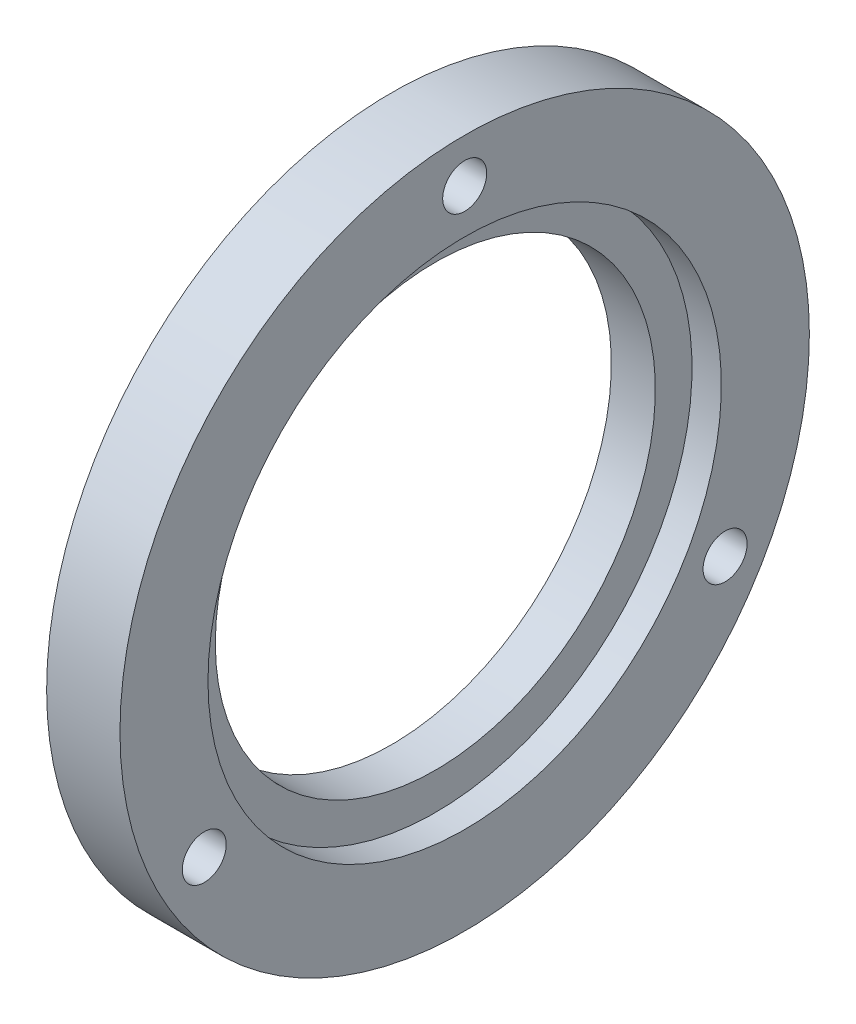
ISO-10303-21;
HEADER;
FILE_DESCRIPTION(('STEP AP214'),'2;1');
FILE_NAME('part.step','',(''),(''),'','','');
FILE_SCHEMA(('AUTOMOTIVE_DESIGN { 1 0 10303 214 1 1 1 1 }'));
ENDSEC;
DATA;
#1=APPLICATION_CONTEXT('core data for automotive mechanical design processes');
#2=APPLICATION_PROTOCOL_DEFINITION('international standard','automotive_design',2000,#1);
#3=PRODUCT_CONTEXT('',#1,'mechanical');
#4=PRODUCT('Part','Part','',(#3));
#5=PRODUCT_RELATED_PRODUCT_CATEGORY('part','',(#4));
#6=PRODUCT_DEFINITION_FORMATION('','',#4);
#7=PRODUCT_DEFINITION_CONTEXT('part definition',#1,'design');
#8=PRODUCT_DEFINITION('design','',#6,#7);
#9=PRODUCT_DEFINITION_SHAPE('','',#8);
#10=(LENGTH_UNIT() NAMED_UNIT(*) SI_UNIT(.MILLI.,.METRE.));
#11=(NAMED_UNIT(*) PLANE_ANGLE_UNIT() SI_UNIT($,.RADIAN.));
#12=(NAMED_UNIT(*) SI_UNIT($,.STERADIAN.) SOLID_ANGLE_UNIT());
#13=UNCERTAINTY_MEASURE_WITH_UNIT(LENGTH_MEASURE(1.E-05),#10,'distance_accuracy_value','');
#14=(GEOMETRIC_REPRESENTATION_CONTEXT(3) GLOBAL_UNCERTAINTY_ASSIGNED_CONTEXT((#13)) GLOBAL_UNIT_ASSIGNED_CONTEXT((#10,
#11,#12)) REPRESENTATION_CONTEXT('',''));
#15=CARTESIAN_POINT('',(0.,0.,0.));
#16=DIRECTION('',(0.,0.,1.));
#17=DIRECTION('',(1.,0.,0.));
#18=AXIS2_PLACEMENT_3D('',#15,#16,#17);
#19=CARTESIAN_POINT('',(0.,0.,0.));
#20=DIRECTION('',(-1.,0.,0.));
#21=DIRECTION('',(0.,0.,1.));
#22=AXIS2_PLACEMENT_3D('',#19,#20,#21);
#23=CYLINDRICAL_SURFACE('',#22,15.);
#24=CARTESIAN_POINT('',(3.,0.,0.));
#25=DIRECTION('',(-1.,0.,0.));
#26=DIRECTION('',(0.,0.,1.));
#27=AXIS2_PLACEMENT_3D('',#24,#25,#26);
#28=CIRCLE('',#27,15.);
#29=CARTESIAN_POINT('',(3.,0.,15.));
#30=VERTEX_POINT('',#29);
#31=EDGE_CURVE('E56',#30,#30,#28,.T.);
#32=ORIENTED_EDGE('',*,*,#31,.F.);
#33=EDGE_LOOP('',(#32));
#34=FACE_BOUND('',#33,.T.);
#35=CARTESIAN_POINT('',(0.,0.,0.));
#36=DIRECTION('',(-1.,0.,0.));
#37=DIRECTION('',(0.,0.,1.));
#38=AXIS2_PLACEMENT_3D('',#35,#36,#37);
#39=CIRCLE('',#38,15.);
#40=CARTESIAN_POINT('',(0.,0.,15.));
#41=VERTEX_POINT('',#40);
#42=EDGE_CURVE('E10',#41,#41,#39,.T.);
#43=ORIENTED_EDGE('',*,*,#42,.T.);
#44=EDGE_LOOP('',(#43));
#45=FACE_BOUND('',#44,.T.);
#46=ADVANCED_FACE('F34',(#34,#45),#23,.F.);
#47=CARTESIAN_POINT('',(0.,15.,0.));
#48=DIRECTION('',(1.,0.,0.));
#49=DIRECTION('',(0.,0.,-1.));
#50=AXIS2_PLACEMENT_3D('',#47,#48,#49);
#51=PLANE('',#50);
#52=CARTESIAN_POINT('',(0.,20.5,0.));
#53=DIRECTION('',(1.,0.,0.));
#54=DIRECTION('',(0.,0.,-1.));
#55=AXIS2_PLACEMENT_3D('',#52,#53,#54);
#56=CIRCLE('',#55,1.5);
#57=CARTESIAN_POINT('',(0.,20.5,-1.5));
#58=VERTEX_POINT('',#57);
#59=EDGE_CURVE('E59',#58,#58,#56,.T.);
#60=ORIENTED_EDGE('',*,*,#59,.T.);
#61=EDGE_LOOP('',(#60));
#62=FACE_BOUND('',#61,.T.);
#63=CARTESIAN_POINT('',(0.,-10.2499999999993,17.7535207775823));
#64=DIRECTION('',(1.,0.,0.));
#65=DIRECTION('',(0.,0.,-1.));
#66=AXIS2_PLACEMENT_3D('',#63,#64,#65);
#67=CIRCLE('',#66,1.5);
#68=CARTESIAN_POINT('',(0.,-10.2499999999993,16.2535207775823));
#69=VERTEX_POINT('',#68);
#70=EDGE_CURVE('E62',#69,#69,#67,.T.);
#71=ORIENTED_EDGE('',*,*,#70,.T.);
#72=EDGE_LOOP('',(#71));
#73=FACE_BOUND('',#72,.T.);
#74=CARTESIAN_POINT('',(0.,-10.2500000000007,-17.7535207775797));
#75=DIRECTION('',(1.,0.,0.));
#76=DIRECTION('',(0.,0.,-1.));
#77=AXIS2_PLACEMENT_3D('',#74,#75,#76);
#78=CIRCLE('',#77,1.5);
#79=CARTESIAN_POINT('',(0.,-10.2500000000007,-19.2535207775797));
#80=VERTEX_POINT('',#79);
#81=EDGE_CURVE('E65',#80,#80,#78,.T.);
#82=ORIENTED_EDGE('',*,*,#81,.T.);
#83=EDGE_LOOP('',(#82));
#84=FACE_BOUND('',#83,.T.);
#85=ORIENTED_EDGE('',*,*,#42,.F.);
#86=EDGE_LOOP('',(#85));
#87=FACE_BOUND('',#86,.T.);
#88=CARTESIAN_POINT('',(0.,0.,0.));
#89=DIRECTION('',(-1.,0.,0.));
#90=DIRECTION('',(0.,0.,1.));
#91=AXIS2_PLACEMENT_3D('',#88,#89,#90);
#92=CIRCLE('',#91,23.5);
#93=CARTESIAN_POINT('',(0.,0.,23.5));
#94=VERTEX_POINT('',#93);
#95=EDGE_CURVE('E40',#94,#94,#92,.T.);
#96=ORIENTED_EDGE('',*,*,#95,.T.);
#97=EDGE_LOOP('',(#96));
#98=FACE_BOUND('',#97,.T.);
#99=ADVANCED_FACE('F88',(#62,#73,#84,#87,#98),#51,.F.);
#100=CARTESIAN_POINT('',(0.,0.,0.));
#101=DIRECTION('',(-1.,0.,0.));
#102=DIRECTION('',(0.,0.,1.));
#103=AXIS2_PLACEMENT_3D('',#100,#101,#102);
#104=CYLINDRICAL_SURFACE('',#103,23.5);
#105=ORIENTED_EDGE('',*,*,#95,.F.);
#106=EDGE_LOOP('',(#105));
#107=FACE_BOUND('',#106,.T.);
#108=CARTESIAN_POINT('',(5.,0.,0.));
#109=DIRECTION('',(-1.,0.,0.));
#110=DIRECTION('',(0.,0.,1.));
#111=AXIS2_PLACEMENT_3D('',#108,#109,#110);
#112=CIRCLE('',#111,23.5);
#113=CARTESIAN_POINT('',(5.,0.,23.5));
#114=VERTEX_POINT('',#113);
#115=EDGE_CURVE('E44',#114,#114,#112,.T.);
#116=ORIENTED_EDGE('',*,*,#115,.T.);
#117=EDGE_LOOP('',(#116));
#118=FACE_BOUND('',#117,.T.);
#119=ADVANCED_FACE('F91',(#107,#118),#104,.T.);
#120=CARTESIAN_POINT('',(5.,23.5,0.));
#121=DIRECTION('',(-1.,0.,0.));
#122=DIRECTION('',(0.,0.,1.));
#123=AXIS2_PLACEMENT_3D('',#120,#121,#122);
#124=PLANE('',#123);
#125=CARTESIAN_POINT('',(5.,20.5,0.));
#126=DIRECTION('',(-1.,0.,0.));
#127=DIRECTION('',(0.,0.,1.));
#128=AXIS2_PLACEMENT_3D('',#125,#126,#127);
#129=CIRCLE('',#128,1.5);
#130=CARTESIAN_POINT('',(5.,20.5,1.5));
#131=VERTEX_POINT('',#130);
#132=EDGE_CURVE('E68',#131,#131,#129,.T.);
#133=ORIENTED_EDGE('',*,*,#132,.T.);
#134=EDGE_LOOP('',(#133));
#135=FACE_BOUND('',#134,.T.);
#136=CARTESIAN_POINT('',(5.,-10.2499999999993,17.7535207775823));
#137=DIRECTION('',(-1.,0.,0.));
#138=DIRECTION('',(0.,0.,1.));
#139=AXIS2_PLACEMENT_3D('',#136,#137,#138);
#140=CIRCLE('',#139,1.5);
#141=CARTESIAN_POINT('',(5.,-10.2499999999993,19.2535207775823));
#142=VERTEX_POINT('',#141);
#143=EDGE_CURVE('E72',#142,#142,#140,.T.);
#144=ORIENTED_EDGE('',*,*,#143,.T.);
#145=EDGE_LOOP('',(#144));
#146=FACE_BOUND('',#145,.T.);
#147=CARTESIAN_POINT('',(5.,-10.2500000000007,-17.7535207775797));
#148=DIRECTION('',(-1.,0.,0.));
#149=DIRECTION('',(0.,0.,1.));
#150=AXIS2_PLACEMENT_3D('',#147,#148,#149);
#151=CIRCLE('',#150,1.5);
#152=CARTESIAN_POINT('',(5.,-10.2500000000007,-16.2535207775797));
#153=VERTEX_POINT('',#152);
#154=EDGE_CURVE('E69',#153,#153,#151,.T.);
#155=ORIENTED_EDGE('',*,*,#154,.T.);
#156=EDGE_LOOP('',(#155));
#157=FACE_BOUND('',#156,.T.);
#158=ORIENTED_EDGE('',*,*,#115,.F.);
#159=EDGE_LOOP('',(#158));
#160=FACE_BOUND('',#159,.T.);
#161=CARTESIAN_POINT('',(5.,0.,0.));
#162=DIRECTION('',(-1.,0.,0.));
#163=DIRECTION('',(0.,0.,1.));
#164=AXIS2_PLACEMENT_3D('',#161,#162,#163);
#165=CIRCLE('',#164,17.5);
#166=CARTESIAN_POINT('',(5.,0.,17.5));
#167=VERTEX_POINT('',#166);
#168=EDGE_CURVE('E48',#167,#167,#165,.T.);
#169=ORIENTED_EDGE('',*,*,#168,.T.);
#170=EDGE_LOOP('',(#169));
#171=FACE_BOUND('',#170,.T.);
#172=ADVANCED_FACE('F78',(#135,#146,#157,#160,#171),#124,.F.);
#173=CARTESIAN_POINT('',(0.,0.,0.));
#174=DIRECTION('',(-1.,0.,0.));
#175=DIRECTION('',(0.,0.,1.));
#176=AXIS2_PLACEMENT_3D('',#173,#174,#175);
#177=CYLINDRICAL_SURFACE('',#176,17.5);
#178=ORIENTED_EDGE('',*,*,#168,.F.);
#179=EDGE_LOOP('',(#178));
#180=FACE_BOUND('',#179,.T.);
#181=CARTESIAN_POINT('',(3.,0.,0.));
#182=DIRECTION('',(-1.,0.,0.));
#183=DIRECTION('',(0.,0.,1.));
#184=AXIS2_PLACEMENT_3D('',#181,#182,#183);
#185=CIRCLE('',#184,17.5);
#186=CARTESIAN_POINT('',(3.,0.,17.5));
#187=VERTEX_POINT('',#186);
#188=EDGE_CURVE('E53',#187,#187,#185,.T.);
#189=ORIENTED_EDGE('',*,*,#188,.T.);
#190=EDGE_LOOP('',(#189));
#191=FACE_BOUND('',#190,.T.);
#192=ADVANCED_FACE('F108',(#180,#191),#177,.F.);
#193=CARTESIAN_POINT('',(3.,17.5,0.));
#194=DIRECTION('',(-1.,0.,0.));
#195=DIRECTION('',(0.,0.,1.));
#196=AXIS2_PLACEMENT_3D('',#193,#194,#195);
#197=PLANE('',#196);
#198=ORIENTED_EDGE('',*,*,#188,.F.);
#199=EDGE_LOOP('',(#198));
#200=FACE_BOUND('',#199,.T.);
#201=ORIENTED_EDGE('',*,*,#31,.T.);
#202=EDGE_LOOP('',(#201));
#203=FACE_BOUND('',#202,.T.);
#204=ADVANCED_FACE('F99',(#200,#203),#197,.F.);
#205=CARTESIAN_POINT('',(5.,-10.2500000000007,-17.7535207775797));
#206=DIRECTION('',(-1.,0.,0.));
#207=DIRECTION('',(0.,0.,1.));
#208=AXIS2_PLACEMENT_3D('',#205,#206,#207);
#209=CYLINDRICAL_SURFACE('',#208,1.5);
#210=ORIENTED_EDGE('',*,*,#154,.F.);
#211=EDGE_LOOP('',(#210));
#212=FACE_BOUND('',#211,.T.);
#213=ORIENTED_EDGE('',*,*,#81,.F.);
#214=EDGE_LOOP('',(#213));
#215=FACE_BOUND('',#214,.T.);
#216=ADVANCED_FACE('F97',(#212,#215),#209,.F.);
#217=CARTESIAN_POINT('',(5.,-10.2499999999993,17.7535207775823));
#218=DIRECTION('',(-1.,0.,0.));
#219=DIRECTION('',(0.,0.,1.));
#220=AXIS2_PLACEMENT_3D('',#217,#218,#219);
#221=CYLINDRICAL_SURFACE('',#220,1.5);
#222=ORIENTED_EDGE('',*,*,#143,.F.);
#223=EDGE_LOOP('',(#222));
#224=FACE_BOUND('',#223,.T.);
#225=ORIENTED_EDGE('',*,*,#70,.F.);
#226=EDGE_LOOP('',(#225));
#227=FACE_BOUND('',#226,.T.);
#228=ADVANCED_FACE('F84',(#224,#227),#221,.F.);
#229=CARTESIAN_POINT('',(5.,20.5,0.));
#230=DIRECTION('',(-1.,0.,0.));
#231=DIRECTION('',(0.,0.,1.));
#232=AXIS2_PLACEMENT_3D('',#229,#230,#231);
#233=CYLINDRICAL_SURFACE('',#232,1.5);
#234=ORIENTED_EDGE('',*,*,#132,.F.);
#235=EDGE_LOOP('',(#234));
#236=FACE_BOUND('',#235,.T.);
#237=ORIENTED_EDGE('',*,*,#59,.F.);
#238=EDGE_LOOP('',(#237));
#239=FACE_BOUND('',#238,.T.);
#240=ADVANCED_FACE('F81',(#236,#239),#233,.F.);
#241=CLOSED_SHELL('',(#46,#99,#119,#172,#192,#204,#216,#228,#240));
#242=MANIFOLD_SOLID_BREP('B2',#241);
#243=ADVANCED_BREP_SHAPE_REPRESENTATION('',(#18,#242),#14);
#244=SHAPE_DEFINITION_REPRESENTATION(#9,#243);
ENDSEC;
END-ISO-10303-21;
